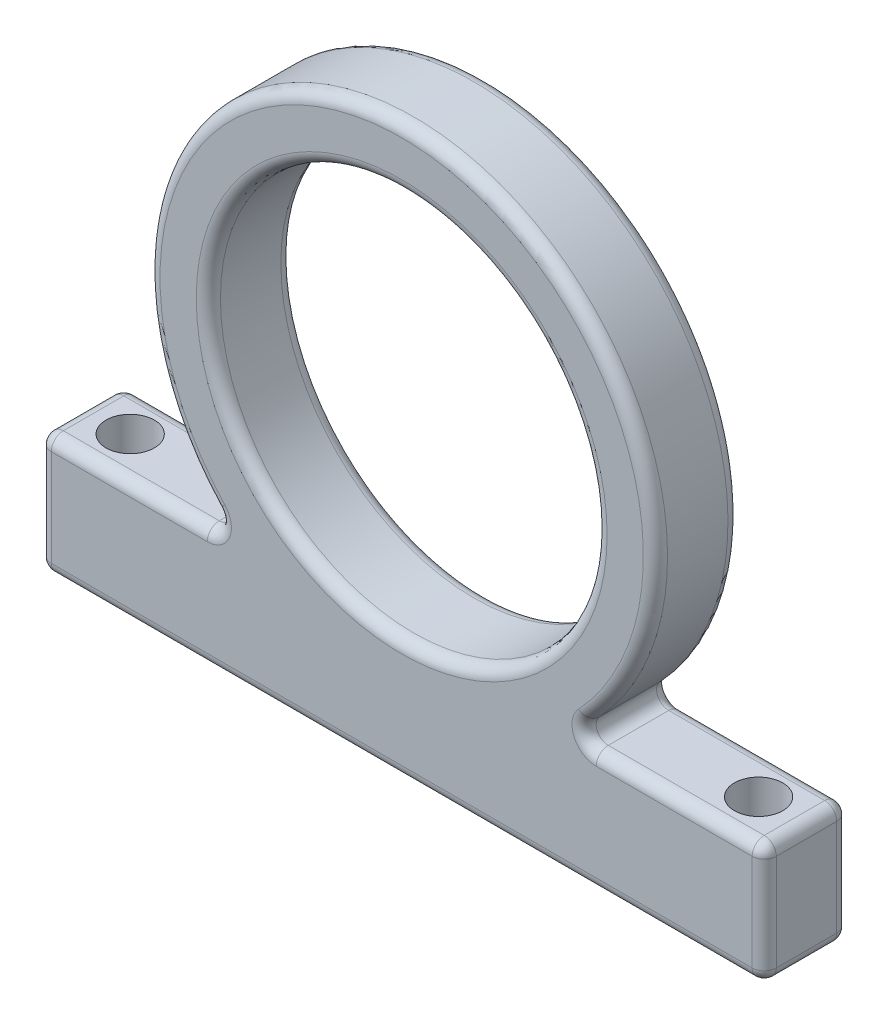
ISO-10303-21;
HEADER;
FILE_DESCRIPTION(('STEP AP214'),'2;1');
FILE_NAME('part.step','',(''),(''),'','','');
FILE_SCHEMA(('AUTOMOTIVE_DESIGN { 1 0 10303 214 1 1 1 1 }'));
ENDSEC;
DATA;
#1=APPLICATION_CONTEXT('core data for automotive mechanical design processes');
#2=APPLICATION_PROTOCOL_DEFINITION('international standard','automotive_design',2000,#1);
#3=PRODUCT_CONTEXT('',#1,'mechanical');
#4=PRODUCT('Part','Part','',(#3));
#5=PRODUCT_RELATED_PRODUCT_CATEGORY('part','',(#4));
#6=PRODUCT_DEFINITION_FORMATION('','',#4);
#7=PRODUCT_DEFINITION_CONTEXT('part definition',#1,'design');
#8=PRODUCT_DEFINITION('design','',#6,#7);
#9=PRODUCT_DEFINITION_SHAPE('','',#8);
#10=(LENGTH_UNIT() NAMED_UNIT(*) SI_UNIT(.MILLI.,.METRE.));
#11=(NAMED_UNIT(*) PLANE_ANGLE_UNIT() SI_UNIT($,.RADIAN.));
#12=(NAMED_UNIT(*) SI_UNIT($,.STERADIAN.) SOLID_ANGLE_UNIT());
#13=UNCERTAINTY_MEASURE_WITH_UNIT(LENGTH_MEASURE(1.E-05),#10,'distance_accuracy_value','');
#14=(GEOMETRIC_REPRESENTATION_CONTEXT(3) GLOBAL_UNCERTAINTY_ASSIGNED_CONTEXT((#13)) GLOBAL_UNIT_ASSIGNED_CONTEXT((#10,
#11,#12)) REPRESENTATION_CONTEXT('',''));
#15=CARTESIAN_POINT('',(0.,0.,0.));
#16=DIRECTION('',(0.,0.,1.));
#17=DIRECTION('',(1.,0.,0.));
#18=AXIS2_PLACEMENT_3D('',#15,#16,#17);
#19=CARTESIAN_POINT('',(0.,0.,7.));
#20=DIRECTION('',(0.,0.,-1.));
#21=DIRECTION('',(-1.,0.,0.));
#22=AXIS2_PLACEMENT_3D('',#19,#20,#21);
#23=PLANE('',#22);
#24=CARTESIAN_POINT('',(0.,0.,7.));
#25=DIRECTION('',(0.,0.,-1.));
#26=DIRECTION('',(-1.,0.,0.));
#27=AXIS2_PLACEMENT_3D('',#24,#25,#26);
#28=CIRCLE('',#27,17.);
#29=CARTESIAN_POINT('',(-17.,0.,7.));
#30=VERTEX_POINT('',#29);
#31=EDGE_CURVE('E193',#30,#30,#28,.T.);
#32=ORIENTED_EDGE('',*,*,#31,.T.);
#33=EDGE_LOOP('',(#32));
#34=FACE_BOUND('',#33,.T.);
#35=DIRECTION('',(-1.,0.,0.));
#36=VECTOR('',#35,1.);
#37=CARTESIAN_POINT('',(0.,-17.,7.));
#38=LINE('',#37,#36);
#39=CARTESIAN_POINT('',(-16.0934769394311,-17.,7.));
#40=VERTEX_POINT('',#39);
#41=CARTESIAN_POINT('',(-29.,-17.,7.));
#42=VERTEX_POINT('',#41);
#43=EDGE_CURVE('E349',#40,#42,#38,.T.);
#44=ORIENTED_EDGE('',*,*,#43,.T.);
#45=DIRECTION('',(0.,-1.,0.));
#46=VECTOR('',#45,1.);
#47=CARTESIAN_POINT('',(-29.,0.,7.));
#48=LINE('',#47,#46);
#49=CARTESIAN_POINT('',(-29.,-25.,7.));
#50=VERTEX_POINT('',#49);
#51=EDGE_CURVE('E268',#42,#50,#48,.T.);
#52=ORIENTED_EDGE('',*,*,#51,.T.);
#53=DIRECTION('',(1.,0.,0.));
#54=VECTOR('',#53,1.);
#55=CARTESIAN_POINT('',(0.,-25.,7.));
#56=LINE('',#55,#54);
#57=CARTESIAN_POINT('',(29.,-25.,7.));
#58=VERTEX_POINT('',#57);
#59=EDGE_CURVE('E266',#50,#58,#56,.T.);
#60=ORIENTED_EDGE('',*,*,#59,.T.);
#61=DIRECTION('',(0.,1.,0.));
#62=VECTOR('',#61,1.);
#63=CARTESIAN_POINT('',(29.,0.,7.));
#64=LINE('',#63,#62);
#65=CARTESIAN_POINT('',(29.,-17.,7.));
#66=VERTEX_POINT('',#65);
#67=EDGE_CURVE('E264',#58,#66,#64,.T.);
#68=ORIENTED_EDGE('',*,*,#67,.T.);
#69=DIRECTION('',(-1.,0.,0.));
#70=VECTOR('',#69,1.);
#71=CARTESIAN_POINT('',(0.,-17.,7.));
#72=LINE('',#71,#70);
#73=CARTESIAN_POINT('',(16.0934769394311,-17.,7.));
#74=VERTEX_POINT('',#73);
#75=EDGE_CURVE('E176',#66,#74,#72,.T.);
#76=ORIENTED_EDGE('',*,*,#75,.T.);
#77=CARTESIAN_POINT('',(16.0934769394311,-15.,7.));
#78=DIRECTION('',(0.,0.,-1.));
#79=DIRECTION('',(-1.,0.,0.));
#80=AXIS2_PLACEMENT_3D('',#77,#78,#79);
#81=CIRCLE('',#80,2.);
#82=CARTESIAN_POINT('',(14.630433581301,-13.6363636363636,7.));
#83=VERTEX_POINT('',#82);
#84=EDGE_CURVE('E170',#74,#83,#81,.T.);
#85=ORIENTED_EDGE('',*,*,#84,.T.);
#86=CARTESIAN_POINT('',(0.,0.,7.));
#87=DIRECTION('',(0.,0.,-1.));
#88=DIRECTION('',(-1.,0.,0.));
#89=AXIS2_PLACEMENT_3D('',#86,#87,#88);
#90=CIRCLE('',#89,20.);
#91=CARTESIAN_POINT('',(-14.630433581301,-13.6363636363636,7.));
#92=VERTEX_POINT('',#91);
#93=EDGE_CURVE('E173',#83,#92,#90,.F.);
#94=ORIENTED_EDGE('',*,*,#93,.T.);
#95=CARTESIAN_POINT('',(-16.0934769394311,-15.,7.));
#96=DIRECTION('',(0.,0.,-1.));
#97=DIRECTION('',(-1.,0.,0.));
#98=AXIS2_PLACEMENT_3D('',#95,#96,#97);
#99=CIRCLE('',#98,2.);
#100=EDGE_CURVE('E391',#92,#40,#99,.T.);
#101=ORIENTED_EDGE('',*,*,#100,.T.);
#102=EDGE_LOOP('',(#44,#52,#60,#68,#76,#85,#94,#101));
#103=FACE_BOUND('',#102,.T.);
#104=ADVANCED_FACE('F35',(#34,#103),#23,.F.);
#105=CARTESIAN_POINT('',(0.,0.,0.));
#106=DIRECTION('',(0.,0.,-1.));
#107=DIRECTION('',(-1.,0.,0.));
#108=AXIS2_PLACEMENT_3D('',#105,#106,#107);
#109=PLANE('',#108);
#110=CARTESIAN_POINT('',(0.,0.,0.));
#111=DIRECTION('',(0.,0.,-1.));
#112=DIRECTION('',(-1.,0.,0.));
#113=AXIS2_PLACEMENT_3D('',#110,#111,#112);
#114=CIRCLE('',#113,17.);
#115=CARTESIAN_POINT('',(-17.,0.,0.));
#116=VERTEX_POINT('',#115);
#117=EDGE_CURVE('E366',#116,#116,#114,.F.);
#118=ORIENTED_EDGE('',*,*,#117,.T.);
#119=EDGE_LOOP('',(#118));
#120=FACE_BOUND('',#119,.T.);
#121=DIRECTION('',(1.,0.,0.));
#122=VECTOR('',#121,1.);
#123=CARTESIAN_POINT('',(-30.,-25.,0.));
#124=LINE('',#123,#122);
#125=CARTESIAN_POINT('',(29.,-25.,0.));
#126=VERTEX_POINT('',#125);
#127=CARTESIAN_POINT('',(-29.,-25.,0.));
#128=VERTEX_POINT('',#127);
#129=EDGE_CURVE('E258',#126,#128,#124,.F.);
#130=ORIENTED_EDGE('',*,*,#129,.T.);
#131=DIRECTION('',(0.,-1.,0.));
#132=VECTOR('',#131,1.);
#133=CARTESIAN_POINT('',(-29.,-17.,0.));
#134=LINE('',#133,#132);
#135=CARTESIAN_POINT('',(-29.,-17.,0.));
#136=VERTEX_POINT('',#135);
#137=EDGE_CURVE('E262',#128,#136,#134,.F.);
#138=ORIENTED_EDGE('',*,*,#137,.T.);
#139=DIRECTION('',(-1.,0.,0.));
#140=VECTOR('',#139,1.);
#141=CARTESIAN_POINT('',(-13.6014705087354,-17.,0.));
#142=LINE('',#141,#140);
#143=CARTESIAN_POINT('',(-16.0934769394311,-17.,0.));
#144=VERTEX_POINT('',#143);
#145=EDGE_CURVE('E371',#136,#144,#142,.F.);
#146=ORIENTED_EDGE('',*,*,#145,.T.);
#147=CARTESIAN_POINT('',(-16.0934769394311,-15.,0.));
#148=DIRECTION('',(0.,0.,-1.));
#149=DIRECTION('',(-1.,0.,0.));
#150=AXIS2_PLACEMENT_3D('',#147,#148,#149);
#151=CIRCLE('',#150,2.);
#152=CARTESIAN_POINT('',(-14.630433581301,-13.6363636363636,0.));
#153=VERTEX_POINT('',#152);
#154=EDGE_CURVE('E181',#144,#153,#151,.F.);
#155=ORIENTED_EDGE('',*,*,#154,.T.);
#156=CARTESIAN_POINT('',(0.,0.,0.));
#157=DIRECTION('',(0.,0.,-1.));
#158=DIRECTION('',(-1.,0.,0.));
#159=AXIS2_PLACEMENT_3D('',#156,#157,#158);
#160=CIRCLE('',#159,20.);
#161=CARTESIAN_POINT('',(14.630433581301,-13.6363636363636,0.));
#162=VERTEX_POINT('',#161);
#163=EDGE_CURVE('E369',#153,#162,#160,.T.);
#164=ORIENTED_EDGE('',*,*,#163,.T.);
#165=CARTESIAN_POINT('',(16.0934769394311,-15.,0.));
#166=DIRECTION('',(0.,0.,-1.));
#167=DIRECTION('',(-1.,0.,0.));
#168=AXIS2_PLACEMENT_3D('',#165,#166,#167);
#169=CIRCLE('',#168,2.);
#170=CARTESIAN_POINT('',(16.0934769394311,-17.,0.));
#171=VERTEX_POINT('',#170);
#172=EDGE_CURVE('E232',#162,#171,#169,.F.);
#173=ORIENTED_EDGE('',*,*,#172,.T.);
#174=DIRECTION('',(-1.,0.,0.));
#175=VECTOR('',#174,1.);
#176=CARTESIAN_POINT('',(30.,-17.,0.));
#177=LINE('',#176,#175);
#178=CARTESIAN_POINT('',(29.,-17.,0.));
#179=VERTEX_POINT('',#178);
#180=EDGE_CURVE('E373',#171,#179,#177,.F.);
#181=ORIENTED_EDGE('',*,*,#180,.T.);
#182=DIRECTION('',(0.,1.,0.));
#183=VECTOR('',#182,1.);
#184=CARTESIAN_POINT('',(29.,-26.,0.));
#185=LINE('',#184,#183);
#186=EDGE_CURVE('E260',#179,#126,#185,.F.);
#187=ORIENTED_EDGE('',*,*,#186,.T.);
#188=EDGE_LOOP('',(#130,#138,#146,#155,#164,#173,#181,#187));
#189=FACE_BOUND('',#188,.T.);
#190=ADVANCED_FACE('F418',(#120,#189),#109,.T.);
#191=CARTESIAN_POINT('',(13.6014705087354,-16.,7.));
#192=DIRECTION('',(0.,-1.,0.));
#193=DIRECTION('',(0.,0.,-1.));
#194=AXIS2_PLACEMENT_3D('',#191,#192,#193);
#195=PLANE('',#194);
#196=CARTESIAN_POINT('',(26.,-16.,3.46767137957346));
#197=DIRECTION('',(0.,1.,0.));
#198=DIRECTION('',(0.,0.,1.));
#199=AXIS2_PLACEMENT_3D('',#196,#197,#198);
#200=CIRCLE('',#199,2.);
#201=CARTESIAN_POINT('',(26.,-16.,5.46767137957346));
#202=VERTEX_POINT('',#201);
#203=EDGE_CURVE('E340',#202,#202,#200,.T.);
#204=ORIENTED_EDGE('',*,*,#203,.F.);
#205=EDGE_LOOP('',(#204));
#206=FACE_BOUND('',#205,.T.);
#207=DIRECTION('',(-1.,0.,0.));
#208=VECTOR('',#207,1.);
#209=CARTESIAN_POINT('',(13.6014705087354,-16.,6.));
#210=LINE('',#209,#208);
#211=CARTESIAN_POINT('',(16.0934769394311,-16.,6.));
#212=VERTEX_POINT('',#211);
#213=CARTESIAN_POINT('',(29.,-16.,6.));
#214=VERTEX_POINT('',#213);
#215=EDGE_CURVE('E356',#212,#214,#210,.F.);
#216=ORIENTED_EDGE('',*,*,#215,.T.);
#217=DIRECTION('',(0.,0.,-1.));
#218=VECTOR('',#217,1.);
#219=CARTESIAN_POINT('',(29.,-16.,7.));
#220=LINE('',#219,#218);
#221=CARTESIAN_POINT('',(29.,-16.,1.));
#222=VERTEX_POINT('',#221);
#223=EDGE_CURVE('E270',#214,#222,#220,.T.);
#224=ORIENTED_EDGE('',*,*,#223,.T.);
#225=DIRECTION('',(-1.,0.,0.));
#226=VECTOR('',#225,1.);
#227=CARTESIAN_POINT('',(13.6014705087355,-16.,1.));
#228=LINE('',#227,#226);
#229=CARTESIAN_POINT('',(16.0934769394311,-16.,1.));
#230=VERTEX_POINT('',#229);
#231=EDGE_CURVE('E354',#222,#230,#228,.T.);
#232=ORIENTED_EDGE('',*,*,#231,.T.);
#233=DIRECTION('',(0.,0.,1.));
#234=VECTOR('',#233,1.);
#235=CARTESIAN_POINT('',(16.0934769394311,-16.,7.));
#236=LINE('',#235,#234);
#237=EDGE_CURVE('E352',#230,#212,#236,.T.);
#238=ORIENTED_EDGE('',*,*,#237,.T.);
#239=EDGE_LOOP('',(#216,#224,#232,#238));
#240=FACE_BOUND('',#239,.T.);
#241=ADVANCED_FACE('F399',(#206,#240),#195,.F.);
#242=CARTESIAN_POINT('',(0.,0.,7.));
#243=DIRECTION('',(0.,0.,-1.));
#244=DIRECTION('',(-1.,0.,0.));
#245=AXIS2_PLACEMENT_3D('',#242,#243,#244);
#246=CYLINDRICAL_SURFACE('',#245,21.);
#247=CARTESIAN_POINT('',(0.,0.,6.));
#248=DIRECTION('',(0.,0.,-1.));
#249=DIRECTION('',(-1.,0.,0.));
#250=AXIS2_PLACEMENT_3D('',#247,#248,#249);
#251=CIRCLE('',#250,21.);
#252=CARTESIAN_POINT('',(-15.361955260366,-14.3181818181818,6.));
#253=VERTEX_POINT('',#252);
#254=CARTESIAN_POINT('',(15.361955260366,-14.3181818181818,6.));
#255=VERTEX_POINT('',#254);
#256=EDGE_CURVE('E386',#253,#255,#251,.T.);
#257=ORIENTED_EDGE('',*,*,#256,.T.);
#258=DIRECTION('',(0.,0.,-1.));
#259=VECTOR('',#258,1.);
#260=CARTESIAN_POINT('',(15.361955260366,-14.3181818181818,7.));
#261=LINE('',#260,#259);
#262=CARTESIAN_POINT('',(15.361955260366,-14.3181818181818,1.));
#263=VERTEX_POINT('',#262);
#264=EDGE_CURVE('E182',#255,#263,#261,.T.);
#265=ORIENTED_EDGE('',*,*,#264,.T.);
#266=CARTESIAN_POINT('',(0.,0.,1.));
#267=DIRECTION('',(0.,0.,-1.));
#268=DIRECTION('',(-1.,0.,0.));
#269=AXIS2_PLACEMENT_3D('',#266,#267,#268);
#270=CIRCLE('',#269,21.);
#271=CARTESIAN_POINT('',(-15.361955260366,-14.3181818181818,1.));
#272=VERTEX_POINT('',#271);
#273=EDGE_CURVE('E384',#263,#272,#270,.F.);
#274=ORIENTED_EDGE('',*,*,#273,.T.);
#275=DIRECTION('',(0.,0.,-1.));
#276=VECTOR('',#275,1.);
#277=CARTESIAN_POINT('',(-15.361955260366,-14.3181818181818,7.));
#278=LINE('',#277,#276);
#279=EDGE_CURVE('E382',#272,#253,#278,.F.);
#280=ORIENTED_EDGE('',*,*,#279,.T.);
#281=EDGE_LOOP('',(#257,#265,#274,#280));
#282=FACE_BOUND('',#281,.T.);
#283=ADVANCED_FACE('F430',(#282),#246,.T.);
#284=CARTESIAN_POINT('',(-13.6014705087354,-16.,7.));
#285=DIRECTION('',(0.,-1.,0.));
#286=DIRECTION('',(1.,0.,0.));
#287=AXIS2_PLACEMENT_3D('',#284,#285,#286);
#288=PLANE('',#287);
#289=CARTESIAN_POINT('',(-26.,-16.,3.46767137957346));
#290=DIRECTION('',(0.,1.,0.));
#291=DIRECTION('',(0.,0.,1.));
#292=AXIS2_PLACEMENT_3D('',#289,#290,#291);
#293=CIRCLE('',#292,2.);
#294=CARTESIAN_POINT('',(-26.,-16.,5.46767137957346));
#295=VERTEX_POINT('',#294);
#296=EDGE_CURVE('E335',#295,#295,#293,.T.);
#297=ORIENTED_EDGE('',*,*,#296,.F.);
#298=EDGE_LOOP('',(#297));
#299=FACE_BOUND('',#298,.T.);
#300=DIRECTION('',(-1.,0.,0.));
#301=VECTOR('',#300,1.);
#302=CARTESIAN_POINT('',(-30.,-16.,1.));
#303=LINE('',#302,#301);
#304=CARTESIAN_POINT('',(-16.0934769394311,-16.,1.));
#305=VERTEX_POINT('',#304);
#306=CARTESIAN_POINT('',(-29.,-16.,1.));
#307=VERTEX_POINT('',#306);
#308=EDGE_CURVE('E361',#305,#307,#303,.T.);
#309=ORIENTED_EDGE('',*,*,#308,.T.);
#310=DIRECTION('',(0.,0.,-1.));
#311=VECTOR('',#310,1.);
#312=CARTESIAN_POINT('',(-29.,-16.,7.));
#313=LINE('',#312,#311);
#314=CARTESIAN_POINT('',(-29.,-16.,6.));
#315=VERTEX_POINT('',#314);
#316=EDGE_CURVE('E256',#307,#315,#313,.F.);
#317=ORIENTED_EDGE('',*,*,#316,.T.);
#318=DIRECTION('',(-1.,0.,0.));
#319=VECTOR('',#318,1.);
#320=CARTESIAN_POINT('',(-13.6014705087354,-16.,6.));
#321=LINE('',#320,#319);
#322=CARTESIAN_POINT('',(-16.0934769394311,-16.,6.));
#323=VERTEX_POINT('',#322);
#324=EDGE_CURVE('E364',#315,#323,#321,.F.);
#325=ORIENTED_EDGE('',*,*,#324,.T.);
#326=DIRECTION('',(0.,0.,1.));
#327=VECTOR('',#326,1.);
#328=CARTESIAN_POINT('',(-16.0934769394311,-16.,0.));
#329=LINE('',#328,#327);
#330=EDGE_CURVE('E359',#323,#305,#329,.F.);
#331=ORIENTED_EDGE('',*,*,#330,.T.);
#332=EDGE_LOOP('',(#309,#317,#325,#331));
#333=FACE_BOUND('',#332,.T.);
#334=ADVANCED_FACE('F532',(#299,#333),#288,.F.);
#335=CARTESIAN_POINT('',(-30.,-26.,7.));
#336=DIRECTION('',(1.,0.,0.));
#337=DIRECTION('',(0.,1.,0.));
#338=AXIS2_PLACEMENT_3D('',#335,#336,#337);
#339=PLANE('',#338);
#340=DIRECTION('',(0.,0.,-1.));
#341=VECTOR('',#340,1.);
#342=CARTESIAN_POINT('',(-30.,-17.,7.));
#343=LINE('',#342,#341);
#344=CARTESIAN_POINT('',(-30.,-17.,6.));
#345=VERTEX_POINT('',#344);
#346=CARTESIAN_POINT('',(-30.,-17.,1.));
#347=VERTEX_POINT('',#346);
#348=EDGE_CURVE('E249',#345,#347,#343,.T.);
#349=ORIENTED_EDGE('',*,*,#348,.T.);
#350=DIRECTION('',(0.,-1.,0.));
#351=VECTOR('',#350,1.);
#352=CARTESIAN_POINT('',(-30.,-26.,1.));
#353=LINE('',#352,#351);
#354=CARTESIAN_POINT('',(-30.,-25.,1.));
#355=VERTEX_POINT('',#354);
#356=EDGE_CURVE('E254',#347,#355,#353,.T.);
#357=ORIENTED_EDGE('',*,*,#356,.T.);
#358=DIRECTION('',(0.,0.,-1.));
#359=VECTOR('',#358,1.);
#360=CARTESIAN_POINT('',(-30.,-25.,7.));
#361=LINE('',#360,#359);
#362=CARTESIAN_POINT('',(-30.,-25.,6.));
#363=VERTEX_POINT('',#362);
#364=EDGE_CURVE('E251',#355,#363,#361,.F.);
#365=ORIENTED_EDGE('',*,*,#364,.T.);
#366=DIRECTION('',(0.,-1.,0.));
#367=VECTOR('',#366,1.);
#368=CARTESIAN_POINT('',(-30.,-26.,6.));
#369=LINE('',#368,#367);
#370=EDGE_CURVE('E247',#363,#345,#369,.F.);
#371=ORIENTED_EDGE('',*,*,#370,.T.);
#372=EDGE_LOOP('',(#349,#357,#365,#371));
#373=FACE_BOUND('',#372,.T.);
#374=ADVANCED_FACE('F456',(#373),#339,.F.);
#375=CARTESIAN_POINT('',(30.,-26.,7.));
#376=DIRECTION('',(0.,1.,0.));
#377=DIRECTION('',(-1.,0.,0.));
#378=AXIS2_PLACEMENT_3D('',#375,#376,#377);
#379=PLANE('',#378);
#380=CARTESIAN_POINT('',(-26.,-26.,3.46767137957346));
#381=DIRECTION('',(0.,1.,0.));
#382=DIRECTION('',(-1.,0.,0.));
#383=AXIS2_PLACEMENT_3D('',#380,#381,#382);
#384=CIRCLE('',#383,2.);
#385=CARTESIAN_POINT('',(-28.,-26.,3.46767137957346));
#386=VERTEX_POINT('',#385);
#387=EDGE_CURVE('E39',#386,#386,#384,.T.);
#388=ORIENTED_EDGE('',*,*,#387,.T.);
#389=EDGE_LOOP('',(#388));
#390=FACE_BOUND('',#389,.T.);
#391=CARTESIAN_POINT('',(26.,-26.,3.46767137957346));
#392=DIRECTION('',(0.,1.,0.));
#393=DIRECTION('',(-1.,0.,0.));
#394=AXIS2_PLACEMENT_3D('',#391,#392,#393);
#395=CIRCLE('',#394,2.);
#396=CARTESIAN_POINT('',(24.,-26.,3.46767137957346));
#397=VERTEX_POINT('',#396);
#398=EDGE_CURVE('E333',#397,#397,#395,.T.);
#399=ORIENTED_EDGE('',*,*,#398,.T.);
#400=EDGE_LOOP('',(#399));
#401=FACE_BOUND('',#400,.T.);
#402=DIRECTION('',(0.,0.,-1.));
#403=VECTOR('',#402,1.);
#404=CARTESIAN_POINT('',(-29.,-26.,7.));
#405=LINE('',#404,#403);
#406=CARTESIAN_POINT('',(-29.,-26.,6.));
#407=VERTEX_POINT('',#406);
#408=CARTESIAN_POINT('',(-29.,-26.,1.));
#409=VERTEX_POINT('',#408);
#410=EDGE_CURVE('E242',#407,#409,#405,.T.);
#411=ORIENTED_EDGE('',*,*,#410,.T.);
#412=DIRECTION('',(1.,0.,0.));
#413=VECTOR('',#412,1.);
#414=CARTESIAN_POINT('',(30.,-26.,1.));
#415=LINE('',#414,#413);
#416=CARTESIAN_POINT('',(29.,-26.,1.));
#417=VERTEX_POINT('',#416);
#418=EDGE_CURVE('E245',#409,#417,#415,.T.);
#419=ORIENTED_EDGE('',*,*,#418,.T.);
#420=DIRECTION('',(0.,0.,-1.));
#421=VECTOR('',#420,1.);
#422=CARTESIAN_POINT('',(29.,-26.,7.));
#423=LINE('',#422,#421);
#424=CARTESIAN_POINT('',(29.,-26.,6.));
#425=VERTEX_POINT('',#424);
#426=EDGE_CURVE('E240',#417,#425,#423,.F.);
#427=ORIENTED_EDGE('',*,*,#426,.T.);
#428=DIRECTION('',(1.,0.,0.));
#429=VECTOR('',#428,1.);
#430=CARTESIAN_POINT('',(30.,-26.,6.));
#431=LINE('',#430,#429);
#432=EDGE_CURVE('E238',#425,#407,#431,.F.);
#433=ORIENTED_EDGE('',*,*,#432,.T.);
#434=EDGE_LOOP('',(#411,#419,#427,#433));
#435=FACE_BOUND('',#434,.T.);
#436=ADVANCED_FACE('F477',(#390,#401,#435),#379,.F.);
#437=CARTESIAN_POINT('',(30.,-16.,7.));
#438=DIRECTION('',(-1.,0.,0.));
#439=DIRECTION('',(0.,-1.,0.));
#440=AXIS2_PLACEMENT_3D('',#437,#438,#439);
#441=PLANE('',#440);
#442=DIRECTION('',(0.,1.,0.));
#443=VECTOR('',#442,1.);
#444=CARTESIAN_POINT('',(30.,-17.,1.));
#445=LINE('',#444,#443);
#446=CARTESIAN_POINT('',(30.,-25.,1.));
#447=VERTEX_POINT('',#446);
#448=CARTESIAN_POINT('',(30.,-17.,1.));
#449=VERTEX_POINT('',#448);
#450=EDGE_CURVE('E44',#447,#449,#445,.T.);
#451=ORIENTED_EDGE('',*,*,#450,.T.);
#452=DIRECTION('',(0.,0.,-1.));
#453=VECTOR('',#452,1.);
#454=CARTESIAN_POINT('',(30.,-17.,7.));
#455=LINE('',#454,#453);
#456=CARTESIAN_POINT('',(30.,-17.,6.));
#457=VERTEX_POINT('',#456);
#458=EDGE_CURVE('E11',#449,#457,#455,.F.);
#459=ORIENTED_EDGE('',*,*,#458,.T.);
#460=DIRECTION('',(0.,1.,0.));
#461=VECTOR('',#460,1.);
#462=CARTESIAN_POINT('',(30.,-16.,6.));
#463=LINE('',#462,#461);
#464=CARTESIAN_POINT('',(30.,-25.,6.));
#465=VERTEX_POINT('',#464);
#466=EDGE_CURVE('E272',#457,#465,#463,.F.);
#467=ORIENTED_EDGE('',*,*,#466,.T.);
#468=DIRECTION('',(0.,0.,-1.));
#469=VECTOR('',#468,1.);
#470=CARTESIAN_POINT('',(30.,-25.,7.));
#471=LINE('',#470,#469);
#472=EDGE_CURVE('E55',#465,#447,#471,.T.);
#473=ORIENTED_EDGE('',*,*,#472,.T.);
#474=EDGE_LOOP('',(#451,#459,#467,#473));
#475=FACE_BOUND('',#474,.T.);
#476=ADVANCED_FACE('F524',(#475),#441,.F.);
#477=CARTESIAN_POINT('',(0.,0.,7.));
#478=DIRECTION('',(0.,0.,-1.));
#479=DIRECTION('',(-1.,0.,0.));
#480=AXIS2_PLACEMENT_3D('',#477,#478,#479);
#481=CYLINDRICAL_SURFACE('',#480,16.);
#482=CARTESIAN_POINT('',(0.,0.,6.));
#483=DIRECTION('',(0.,0.,-1.));
#484=DIRECTION('',(-1.,0.,0.));
#485=AXIS2_PLACEMENT_3D('',#482,#483,#484);
#486=CIRCLE('',#485,16.);
#487=CARTESIAN_POINT('',(-16.,0.,6.));
#488=VERTEX_POINT('',#487);
#489=EDGE_CURVE('E379',#488,#488,#486,.F.);
#490=ORIENTED_EDGE('',*,*,#489,.T.);
#491=EDGE_LOOP('',(#490));
#492=FACE_BOUND('',#491,.T.);
#493=CARTESIAN_POINT('',(0.,0.,1.));
#494=DIRECTION('',(0.,0.,-1.));
#495=DIRECTION('',(-1.,0.,0.));
#496=AXIS2_PLACEMENT_3D('',#493,#494,#495);
#497=CIRCLE('',#496,16.);
#498=CARTESIAN_POINT('',(-16.,0.,1.));
#499=VERTEX_POINT('',#498);
#500=EDGE_CURVE('E376',#499,#499,#497,.T.);
#501=ORIENTED_EDGE('',*,*,#500,.T.);
#502=EDGE_LOOP('',(#501));
#503=FACE_BOUND('',#502,.T.);
#504=ADVANCED_FACE('F521',(#492,#503),#481,.F.);
#505=CARTESIAN_POINT('',(-13.6014705087354,-17.,1.));
#506=DIRECTION('',(1.,0.,0.));
#507=DIRECTION('',(0.,1.,0.));
#508=AXIS2_PLACEMENT_3D('',#505,#506,#507);
#509=CYLINDRICAL_SURFACE('',#508,1.);
#510=ORIENTED_EDGE('',*,*,#145,.F.);
#511=CARTESIAN_POINT('',(-29.,-17.,1.));
#512=DIRECTION('',(1.,0.,0.));
#513=DIRECTION('',(0.,1.,0.));
#514=AXIS2_PLACEMENT_3D('',#511,#512,#513);
#515=CIRCLE('',#514,1.);
#516=EDGE_CURVE('E228',#136,#307,#515,.T.);
#517=ORIENTED_EDGE('',*,*,#516,.T.);
#518=ORIENTED_EDGE('',*,*,#308,.F.);
#519=CARTESIAN_POINT('',(-16.0934769394311,-17.,1.));
#520=DIRECTION('',(1.,0.,0.));
#521=DIRECTION('',(0.,0.,-1.));
#522=AXIS2_PLACEMENT_3D('',#519,#520,#521);
#523=CIRCLE('',#522,1.);
#524=EDGE_CURVE('E194',#144,#305,#523,.T.);
#525=ORIENTED_EDGE('',*,*,#524,.F.);
#526=EDGE_LOOP('',(#510,#517,#518,#525));
#527=FACE_BOUND('',#526,.T.);
#528=ADVANCED_FACE('F567',(#527),#509,.T.);
#529=CARTESIAN_POINT('',(-16.0934769394311,-15.,1.));
#530=DIRECTION('',(0.,0.,-1.));
#531=DIRECTION('',(-1.,0.,0.));
#532=AXIS2_PLACEMENT_3D('',#529,#530,#531);
#533=TOROIDAL_SURFACE('',#532,2.,1.);
#534=ORIENTED_EDGE('',*,*,#154,.F.);
#535=ORIENTED_EDGE('',*,*,#524,.T.);
#536=CARTESIAN_POINT('',(-16.0934769394311,-15.,1.));
#537=DIRECTION('',(0.,0.,-1.));
#538=DIRECTION('',(-1.,0.,0.));
#539=AXIS2_PLACEMENT_3D('',#536,#537,#538);
#540=CIRCLE('',#539,1.);
#541=EDGE_CURVE('E223',#272,#305,#540,.T.);
#542=ORIENTED_EDGE('',*,*,#541,.F.);
#543=CARTESIAN_POINT('',(-14.630433581301,-13.6363636363636,1.));
#544=DIRECTION('',(0.681818181818182,-0.731521679065049,0.));
#545=DIRECTION('',(0.731521679065049,0.681818181818182,0.));
#546=AXIS2_PLACEMENT_3D('',#543,#544,#545);
#547=CIRCLE('',#546,1.);
#548=EDGE_CURVE('E220',#153,#272,#547,.F.);
#549=ORIENTED_EDGE('',*,*,#548,.F.);
#550=EDGE_LOOP('',(#534,#535,#542,#549));
#551=FACE_BOUND('',#550,.T.);
#552=ADVANCED_FACE('F564',(#551),#533,.T.);
#553=CARTESIAN_POINT('',(0.,-17.,6.));
#554=DIRECTION('',(-1.,0.,0.));
#555=DIRECTION('',(0.,-1.,0.));
#556=AXIS2_PLACEMENT_3D('',#553,#554,#555);
#557=CYLINDRICAL_SURFACE('',#556,1.);
#558=ORIENTED_EDGE('',*,*,#324,.F.);
#559=CARTESIAN_POINT('',(-29.,-17.,6.));
#560=DIRECTION('',(-1.,0.,0.));
#561=DIRECTION('',(0.,-1.,0.));
#562=AXIS2_PLACEMENT_3D('',#559,#560,#561);
#563=CIRCLE('',#562,1.);
#564=EDGE_CURVE('E231',#315,#42,#563,.F.);
#565=ORIENTED_EDGE('',*,*,#564,.T.);
#566=ORIENTED_EDGE('',*,*,#43,.F.);
#567=CARTESIAN_POINT('',(-16.0934769394311,-17.,6.));
#568=DIRECTION('',(1.,0.,0.));
#569=DIRECTION('',(0.,0.,-1.));
#570=AXIS2_PLACEMENT_3D('',#567,#568,#569);
#571=CIRCLE('',#570,1.);
#572=EDGE_CURVE('E217',#323,#40,#571,.T.);
#573=ORIENTED_EDGE('',*,*,#572,.F.);
#574=EDGE_LOOP('',(#558,#565,#566,#573));
#575=FACE_BOUND('',#574,.T.);
#576=ADVANCED_FACE('F443',(#575),#557,.T.);
#577=CARTESIAN_POINT('',(-16.0934769394311,-15.,7.));
#578=DIRECTION('',(0.,0.,-1.));
#579=DIRECTION('',(-1.,0.,0.));
#580=AXIS2_PLACEMENT_3D('',#577,#578,#579);
#581=CYLINDRICAL_SURFACE('',#580,1.);
#582=ORIENTED_EDGE('',*,*,#541,.T.);
#583=ORIENTED_EDGE('',*,*,#330,.F.);
#584=CARTESIAN_POINT('',(-16.0934769394311,-15.,6.));
#585=DIRECTION('',(0.,0.,-1.));
#586=DIRECTION('',(-1.,0.,0.));
#587=AXIS2_PLACEMENT_3D('',#584,#585,#586);
#588=CIRCLE('',#587,1.);
#589=EDGE_CURVE('E214',#253,#323,#588,.T.);
#590=ORIENTED_EDGE('',*,*,#589,.F.);
#591=ORIENTED_EDGE('',*,*,#279,.F.);
#592=EDGE_LOOP('',(#582,#583,#590,#591));
#593=FACE_BOUND('',#592,.T.);
#594=ADVANCED_FACE('F435',(#593),#581,.F.);
#595=CARTESIAN_POINT('',(0.,0.,1.));
#596=DIRECTION('',(0.,0.,-1.));
#597=DIRECTION('',(-1.,0.,0.));
#598=AXIS2_PLACEMENT_3D('',#595,#596,#597);
#599=TOROIDAL_SURFACE('',#598,20.,1.);
#600=ORIENTED_EDGE('',*,*,#548,.T.);
#601=ORIENTED_EDGE('',*,*,#273,.F.);
#602=CARTESIAN_POINT('',(14.630433581301,-13.6363636363636,1.));
#603=DIRECTION('',(-0.681818181818181,-0.73152167906505,0.));
#604=DIRECTION('',(0.73152167906505,-0.681818181818181,0.));
#605=AXIS2_PLACEMENT_3D('',#602,#603,#604);
#606=CIRCLE('',#605,1.);
#607=EDGE_CURVE('E211',#162,#263,#606,.T.);
#608=ORIENTED_EDGE('',*,*,#607,.F.);
#609=ORIENTED_EDGE('',*,*,#163,.F.);
#610=EDGE_LOOP('',(#600,#601,#608,#609));
#611=FACE_BOUND('',#610,.T.);
#612=ADVANCED_FACE('F556',(#611),#599,.T.);
#613=CARTESIAN_POINT('',(13.6014705087354,-17.,1.));
#614=DIRECTION('',(1.,0.,0.));
#615=DIRECTION('',(0.,0.,-1.));
#616=AXIS2_PLACEMENT_3D('',#613,#614,#615);
#617=CYLINDRICAL_SURFACE('',#616,1.);
#618=ORIENTED_EDGE('',*,*,#231,.F.);
#619=CARTESIAN_POINT('',(29.,-17.,1.));
#620=DIRECTION('',(1.,0.,0.));
#621=DIRECTION('',(0.,0.,-1.));
#622=AXIS2_PLACEMENT_3D('',#619,#620,#621);
#623=CIRCLE('',#622,1.);
#624=EDGE_CURVE('E234',#222,#179,#623,.F.);
#625=ORIENTED_EDGE('',*,*,#624,.T.);
#626=ORIENTED_EDGE('',*,*,#180,.F.);
#627=CARTESIAN_POINT('',(16.0934769394311,-17.,1.));
#628=DIRECTION('',(-1.,0.,0.));
#629=DIRECTION('',(0.,0.,1.));
#630=AXIS2_PLACEMENT_3D('',#627,#628,#629);
#631=CIRCLE('',#630,1.);
#632=EDGE_CURVE('E208',#230,#171,#631,.T.);
#633=ORIENTED_EDGE('',*,*,#632,.F.);
#634=EDGE_LOOP('',(#618,#625,#626,#633));
#635=FACE_BOUND('',#634,.T.);
#636=ADVANCED_FACE('F415',(#635),#617,.T.);
#637=CARTESIAN_POINT('',(-16.0934769394311,-15.,6.));
#638=DIRECTION('',(0.,0.,-1.));
#639=DIRECTION('',(-1.,0.,0.));
#640=AXIS2_PLACEMENT_3D('',#637,#638,#639);
#641=TOROIDAL_SURFACE('',#640,2.,1.);
#642=ORIENTED_EDGE('',*,*,#572,.T.);
#643=ORIENTED_EDGE('',*,*,#100,.F.);
#644=CARTESIAN_POINT('',(-14.630433581301,-13.6363636363636,6.));
#645=DIRECTION('',(0.681818181818182,-0.731521679065049,0.));
#646=DIRECTION('',(0.731521679065049,0.681818181818182,0.));
#647=AXIS2_PLACEMENT_3D('',#644,#645,#646);
#648=CIRCLE('',#647,1.);
#649=EDGE_CURVE('E192',#253,#92,#648,.F.);
#650=ORIENTED_EDGE('',*,*,#649,.F.);
#651=ORIENTED_EDGE('',*,*,#589,.T.);
#652=EDGE_LOOP('',(#642,#643,#650,#651));
#653=FACE_BOUND('',#652,.T.);
#654=ADVANCED_FACE('F438',(#653),#641,.T.);
#655=CARTESIAN_POINT('',(16.0934769394311,-15.,1.));
#656=DIRECTION('',(0.,0.,-1.));
#657=DIRECTION('',(-1.,0.,0.));
#658=AXIS2_PLACEMENT_3D('',#655,#656,#657);
#659=TOROIDAL_SURFACE('',#658,2.,1.);
#660=ORIENTED_EDGE('',*,*,#172,.F.);
#661=ORIENTED_EDGE('',*,*,#607,.T.);
#662=CARTESIAN_POINT('',(16.0934769394311,-15.,1.));
#663=DIRECTION('',(0.,0.,-1.));
#664=DIRECTION('',(-1.,0.,0.));
#665=AXIS2_PLACEMENT_3D('',#662,#663,#664);
#666=CIRCLE('',#665,1.);
#667=EDGE_CURVE('E199',#230,#263,#666,.T.);
#668=ORIENTED_EDGE('',*,*,#667,.F.);
#669=ORIENTED_EDGE('',*,*,#632,.T.);
#670=EDGE_LOOP('',(#660,#661,#668,#669));
#671=FACE_BOUND('',#670,.T.);
#672=ADVANCED_FACE('F424',(#671),#659,.T.);
#673=CARTESIAN_POINT('',(0.,0.,6.));
#674=DIRECTION('',(0.,0.,-1.));
#675=DIRECTION('',(-1.,0.,0.));
#676=AXIS2_PLACEMENT_3D('',#673,#674,#675);
#677=TOROIDAL_SURFACE('',#676,20.,1.);
#678=ORIENTED_EDGE('',*,*,#649,.T.);
#679=ORIENTED_EDGE('',*,*,#93,.F.);
#680=CARTESIAN_POINT('',(14.630433581301,-13.6363636363636,6.));
#681=DIRECTION('',(-0.681818181818181,-0.73152167906505,0.));
#682=DIRECTION('',(0.73152167906505,-0.681818181818181,0.));
#683=AXIS2_PLACEMENT_3D('',#680,#681,#682);
#684=CIRCLE('',#683,1.);
#685=EDGE_CURVE('E189',#255,#83,#684,.T.);
#686=ORIENTED_EDGE('',*,*,#685,.F.);
#687=ORIENTED_EDGE('',*,*,#256,.F.);
#688=EDGE_LOOP('',(#678,#679,#686,#687));
#689=FACE_BOUND('',#688,.T.);
#690=ADVANCED_FACE('F187',(#689),#677,.T.);
#691=CARTESIAN_POINT('',(16.0934769394311,-15.,7.));
#692=DIRECTION('',(0.,0.,-1.));
#693=DIRECTION('',(-1.,0.,0.));
#694=AXIS2_PLACEMENT_3D('',#691,#692,#693);
#695=CYLINDRICAL_SURFACE('',#694,1.);
#696=ORIENTED_EDGE('',*,*,#667,.T.);
#697=ORIENTED_EDGE('',*,*,#264,.F.);
#698=CARTESIAN_POINT('',(16.0934769394311,-15.,6.));
#699=DIRECTION('',(0.,0.,-1.));
#700=DIRECTION('',(-1.,0.,0.));
#701=AXIS2_PLACEMENT_3D('',#698,#699,#700);
#702=CIRCLE('',#701,1.);
#703=EDGE_CURVE('E198',#212,#255,#702,.T.);
#704=ORIENTED_EDGE('',*,*,#703,.F.);
#705=ORIENTED_EDGE('',*,*,#237,.F.);
#706=EDGE_LOOP('',(#696,#697,#704,#705));
#707=FACE_BOUND('',#706,.T.);
#708=ADVANCED_FACE('F427',(#707),#695,.F.);
#709=CARTESIAN_POINT('',(16.0934769394311,-15.,6.));
#710=DIRECTION('',(0.,0.,-1.));
#711=DIRECTION('',(-1.,0.,0.));
#712=AXIS2_PLACEMENT_3D('',#709,#710,#711);
#713=TOROIDAL_SURFACE('',#712,2.,1.);
#714=ORIENTED_EDGE('',*,*,#685,.T.);
#715=ORIENTED_EDGE('',*,*,#84,.F.);
#716=CARTESIAN_POINT('',(16.0934769394311,-17.,6.));
#717=DIRECTION('',(-1.,0.,0.));
#718=DIRECTION('',(0.,0.,1.));
#719=AXIS2_PLACEMENT_3D('',#716,#717,#718);
#720=CIRCLE('',#719,1.);
#721=EDGE_CURVE('E203',#212,#74,#720,.F.);
#722=ORIENTED_EDGE('',*,*,#721,.F.);
#723=ORIENTED_EDGE('',*,*,#703,.T.);
#724=EDGE_LOOP('',(#714,#715,#722,#723));
#725=FACE_BOUND('',#724,.T.);
#726=ADVANCED_FACE('F196',(#725),#713,.T.);
#727=CARTESIAN_POINT('',(0.,-17.,6.));
#728=DIRECTION('',(-1.,0.,0.));
#729=DIRECTION('',(0.,0.,1.));
#730=AXIS2_PLACEMENT_3D('',#727,#728,#729);
#731=CYLINDRICAL_SURFACE('',#730,1.);
#732=ORIENTED_EDGE('',*,*,#75,.F.);
#733=CARTESIAN_POINT('',(29.,-17.,6.));
#734=DIRECTION('',(-1.,0.,0.));
#735=DIRECTION('',(0.,0.,1.));
#736=AXIS2_PLACEMENT_3D('',#733,#734,#735);
#737=CIRCLE('',#736,1.);
#738=EDGE_CURVE('E236',#66,#214,#737,.T.);
#739=ORIENTED_EDGE('',*,*,#738,.T.);
#740=ORIENTED_EDGE('',*,*,#215,.F.);
#741=ORIENTED_EDGE('',*,*,#721,.T.);
#742=EDGE_LOOP('',(#732,#739,#740,#741));
#743=FACE_BOUND('',#742,.T.);
#744=ADVANCED_FACE('F395',(#743),#731,.T.);
#745=CARTESIAN_POINT('',(0.,0.,6.));
#746=DIRECTION('',(0.,0.,-1.));
#747=DIRECTION('',(-1.,0.,0.));
#748=AXIS2_PLACEMENT_3D('',#745,#746,#747);
#749=TOROIDAL_SURFACE('',#748,17.,1.);
#750=ORIENTED_EDGE('',*,*,#31,.F.);
#751=EDGE_LOOP('',(#750));
#752=FACE_BOUND('',#751,.T.);
#753=ORIENTED_EDGE('',*,*,#489,.F.);
#754=EDGE_LOOP('',(#753));
#755=FACE_BOUND('',#754,.T.);
#756=ADVANCED_FACE('F543',(#752,#755),#749,.T.);
#757=CARTESIAN_POINT('',(0.,0.,1.));
#758=DIRECTION('',(0.,0.,-1.));
#759=DIRECTION('',(-1.,0.,0.));
#760=AXIS2_PLACEMENT_3D('',#757,#758,#759);
#761=TOROIDAL_SURFACE('',#760,17.,1.);
#762=ORIENTED_EDGE('',*,*,#500,.F.);
#763=EDGE_LOOP('',(#762));
#764=FACE_BOUND('',#763,.T.);
#765=ORIENTED_EDGE('',*,*,#117,.F.);
#766=EDGE_LOOP('',(#765));
#767=FACE_BOUND('',#766,.T.);
#768=ADVANCED_FACE('F574',(#764,#767),#761,.T.);
#769=CARTESIAN_POINT('',(29.,-17.,6.));
#770=DIRECTION('',(-1.,0.,0.));
#771=DIRECTION('',(0.,-1.,0.));
#772=AXIS2_PLACEMENT_3D('',#769,#770,#771);
#773=SPHERICAL_SURFACE('',#772,1.);
#774=CARTESIAN_POINT('',(29.,-17.,6.));
#775=DIRECTION('',(0.,0.,-1.));
#776=DIRECTION('',(-1.,0.,0.));
#777=AXIS2_PLACEMENT_3D('',#774,#775,#776);
#778=CIRCLE('',#777,1.);
#779=EDGE_CURVE('E328',#214,#457,#778,.T.);
#780=ORIENTED_EDGE('',*,*,#779,.F.);
#781=ORIENTED_EDGE('',*,*,#738,.F.);
#782=CARTESIAN_POINT('',(29.,-17.,6.));
#783=DIRECTION('',(0.,-1.,0.));
#784=DIRECTION('',(0.,0.,-1.));
#785=AXIS2_PLACEMENT_3D('',#782,#783,#784);
#786=CIRCLE('',#785,1.);
#787=EDGE_CURVE('E331',#457,#66,#786,.T.);
#788=ORIENTED_EDGE('',*,*,#787,.F.);
#789=EDGE_LOOP('',(#780,#781,#788));
#790=FACE_BOUND('',#789,.T.);
#791=ADVANCED_FACE('F37',(#790),#773,.T.);
#792=CARTESIAN_POINT('',(29.,0.,6.));
#793=DIRECTION('',(0.,1.,0.));
#794=DIRECTION('',(-1.,0.,0.));
#795=AXIS2_PLACEMENT_3D('',#792,#793,#794);
#796=CYLINDRICAL_SURFACE('',#795,1.);
#797=ORIENTED_EDGE('',*,*,#787,.T.);
#798=ORIENTED_EDGE('',*,*,#67,.F.);
#799=CARTESIAN_POINT('',(29.,-25.,6.));
#800=DIRECTION('',(0.,-1.,0.));
#801=DIRECTION('',(0.,0.,-1.));
#802=AXIS2_PLACEMENT_3D('',#799,#800,#801);
#803=CIRCLE('',#802,1.);
#804=EDGE_CURVE('E325',#465,#58,#803,.T.);
#805=ORIENTED_EDGE('',*,*,#804,.F.);
#806=ORIENTED_EDGE('',*,*,#466,.F.);
#807=EDGE_LOOP('',(#797,#798,#805,#806));
#808=FACE_BOUND('',#807,.T.);
#809=ADVANCED_FACE('F492',(#808),#796,.T.);
#810=CARTESIAN_POINT('',(29.,-17.,7.));
#811=DIRECTION('',(0.,0.,-1.));
#812=DIRECTION('',(-1.,0.,0.));
#813=AXIS2_PLACEMENT_3D('',#810,#811,#812);
#814=CYLINDRICAL_SURFACE('',#813,1.);
#815=ORIENTED_EDGE('',*,*,#779,.T.);
#816=ORIENTED_EDGE('',*,*,#458,.F.);
#817=CARTESIAN_POINT('',(29.,-17.,1.));
#818=DIRECTION('',(0.,0.,-1.));
#819=DIRECTION('',(-1.,0.,0.));
#820=AXIS2_PLACEMENT_3D('',#817,#818,#819);
#821=CIRCLE('',#820,1.);
#822=EDGE_CURVE('E322',#222,#449,#821,.T.);
#823=ORIENTED_EDGE('',*,*,#822,.F.);
#824=ORIENTED_EDGE('',*,*,#223,.F.);
#825=EDGE_LOOP('',(#815,#816,#823,#824));
#826=FACE_BOUND('',#825,.T.);
#827=ADVANCED_FACE('F407',(#826),#814,.T.);
#828=CARTESIAN_POINT('',(29.,-25.,6.));
#829=DIRECTION('',(0.,0.,1.));
#830=DIRECTION('',(1.,0.,0.));
#831=AXIS2_PLACEMENT_3D('',#828,#829,#830);
#832=SPHERICAL_SURFACE('',#831,1.);
#833=CARTESIAN_POINT('',(29.,-25.,6.));
#834=DIRECTION('',(0.,0.,1.));
#835=DIRECTION('',(1.,0.,0.));
#836=AXIS2_PLACEMENT_3D('',#833,#834,#835);
#837=CIRCLE('',#836,1.);
#838=EDGE_CURVE('E316',#465,#425,#837,.F.);
#839=ORIENTED_EDGE('',*,*,#838,.F.);
#840=ORIENTED_EDGE('',*,*,#804,.T.);
#841=CARTESIAN_POINT('',(29.,-25.,6.));
#842=DIRECTION('',(1.,0.,0.));
#843=DIRECTION('',(0.,0.,-1.));
#844=AXIS2_PLACEMENT_3D('',#841,#842,#843);
#845=CIRCLE('',#844,1.);
#846=EDGE_CURVE('E319',#425,#58,#845,.F.);
#847=ORIENTED_EDGE('',*,*,#846,.F.);
#848=EDGE_LOOP('',(#839,#840,#847));
#849=FACE_BOUND('',#848,.T.);
#850=ADVANCED_FACE('F496',(#849),#832,.T.);
#851=CARTESIAN_POINT('',(29.,-17.,1.));
#852=DIRECTION('',(-1.,0.,0.));
#853=DIRECTION('',(0.,-1.,0.));
#854=AXIS2_PLACEMENT_3D('',#851,#852,#853);
#855=SPHERICAL_SURFACE('',#854,1.);
#856=ORIENTED_EDGE('',*,*,#624,.F.);
#857=ORIENTED_EDGE('',*,*,#822,.T.);
#858=CARTESIAN_POINT('',(29.,-17.,1.));
#859=DIRECTION('',(0.,-1.,0.));
#860=DIRECTION('',(0.,0.,-1.));
#861=AXIS2_PLACEMENT_3D('',#858,#859,#860);
#862=CIRCLE('',#861,1.);
#863=EDGE_CURVE('E313',#179,#449,#862,.T.);
#864=ORIENTED_EDGE('',*,*,#863,.F.);
#865=EDGE_LOOP('',(#856,#857,#864));
#866=FACE_BOUND('',#865,.T.);
#867=ADVANCED_FACE('F411',(#866),#855,.T.);
#868=CARTESIAN_POINT('',(0.,-25.,6.));
#869=DIRECTION('',(1.,0.,0.));
#870=DIRECTION('',(0.,1.,0.));
#871=AXIS2_PLACEMENT_3D('',#868,#869,#870);
#872=CYLINDRICAL_SURFACE('',#871,1.);
#873=ORIENTED_EDGE('',*,*,#846,.T.);
#874=ORIENTED_EDGE('',*,*,#59,.F.);
#875=CARTESIAN_POINT('',(-29.,-25.,6.));
#876=DIRECTION('',(-1.,0.,0.));
#877=DIRECTION('',(0.,0.,1.));
#878=AXIS2_PLACEMENT_3D('',#875,#876,#877);
#879=CIRCLE('',#878,1.);
#880=EDGE_CURVE('E310',#407,#50,#879,.T.);
#881=ORIENTED_EDGE('',*,*,#880,.F.);
#882=ORIENTED_EDGE('',*,*,#432,.F.);
#883=EDGE_LOOP('',(#873,#874,#881,#882));
#884=FACE_BOUND('',#883,.T.);
#885=ADVANCED_FACE('F483',(#884),#872,.T.);
#886=CARTESIAN_POINT('',(29.,-25.,7.));
#887=DIRECTION('',(0.,0.,-1.));
#888=DIRECTION('',(-1.,0.,0.));
#889=AXIS2_PLACEMENT_3D('',#886,#887,#888);
#890=CYLINDRICAL_SURFACE('',#889,1.);
#891=ORIENTED_EDGE('',*,*,#838,.T.);
#892=ORIENTED_EDGE('',*,*,#426,.F.);
#893=CARTESIAN_POINT('',(29.,-25.,1.));
#894=DIRECTION('',(0.,0.,-1.));
#895=DIRECTION('',(-1.,0.,0.));
#896=AXIS2_PLACEMENT_3D('',#893,#894,#895);
#897=CIRCLE('',#896,1.);
#898=EDGE_CURVE('E307',#447,#417,#897,.T.);
#899=ORIENTED_EDGE('',*,*,#898,.F.);
#900=ORIENTED_EDGE('',*,*,#472,.F.);
#901=EDGE_LOOP('',(#891,#892,#899,#900));
#902=FACE_BOUND('',#901,.T.);
#903=ADVANCED_FACE('F499',(#902),#890,.T.);
#904=CARTESIAN_POINT('',(29.,-16.,1.));
#905=DIRECTION('',(0.,-1.,0.));
#906=DIRECTION('',(1.,0.,0.));
#907=AXIS2_PLACEMENT_3D('',#904,#905,#906);
#908=CYLINDRICAL_SURFACE('',#907,1.);
#909=ORIENTED_EDGE('',*,*,#863,.T.);
#910=ORIENTED_EDGE('',*,*,#450,.F.);
#911=CARTESIAN_POINT('',(29.,-25.,1.));
#912=DIRECTION('',(0.,-1.,0.));
#913=DIRECTION('',(0.,0.,-1.));
#914=AXIS2_PLACEMENT_3D('',#911,#912,#913);
#915=CIRCLE('',#914,1.);
#916=EDGE_CURVE('E304',#126,#447,#915,.T.);
#917=ORIENTED_EDGE('',*,*,#916,.F.);
#918=ORIENTED_EDGE('',*,*,#186,.F.);
#919=EDGE_LOOP('',(#909,#910,#917,#918));
#920=FACE_BOUND('',#919,.T.);
#921=ADVANCED_FACE('F503',(#920),#908,.T.);
#922=CARTESIAN_POINT('',(-29.,-25.,6.));
#923=DIRECTION('',(0.,0.,1.));
#924=DIRECTION('',(1.,0.,0.));
#925=AXIS2_PLACEMENT_3D('',#922,#923,#924);
#926=SPHERICAL_SURFACE('',#925,1.);
#927=CARTESIAN_POINT('',(-29.,-25.,6.));
#928=DIRECTION('',(0.,0.,1.));
#929=DIRECTION('',(1.,0.,0.));
#930=AXIS2_PLACEMENT_3D('',#927,#928,#929);
#931=CIRCLE('',#930,1.);
#932=EDGE_CURVE('E298',#407,#363,#931,.F.);
#933=ORIENTED_EDGE('',*,*,#932,.F.);
#934=ORIENTED_EDGE('',*,*,#880,.T.);
#935=CARTESIAN_POINT('',(-29.,-25.,6.));
#936=DIRECTION('',(0.,-1.,0.));
#937=DIRECTION('',(0.,0.,-1.));
#938=AXIS2_PLACEMENT_3D('',#935,#936,#937);
#939=CIRCLE('',#938,1.);
#940=EDGE_CURVE('E301',#363,#50,#939,.F.);
#941=ORIENTED_EDGE('',*,*,#940,.F.);
#942=EDGE_LOOP('',(#933,#934,#941));
#943=FACE_BOUND('',#942,.T.);
#944=ADVANCED_FACE('F486',(#943),#926,.T.);
#945=CARTESIAN_POINT('',(29.,-25.,1.));
#946=DIRECTION('',(0.,0.,1.));
#947=DIRECTION('',(1.,0.,0.));
#948=AXIS2_PLACEMENT_3D('',#945,#946,#947);
#949=SPHERICAL_SURFACE('',#948,1.);
#950=ORIENTED_EDGE('',*,*,#916,.T.);
#951=ORIENTED_EDGE('',*,*,#898,.T.);
#952=CARTESIAN_POINT('',(29.,-25.,1.));
#953=DIRECTION('',(1.,0.,0.));
#954=DIRECTION('',(0.,0.,-1.));
#955=AXIS2_PLACEMENT_3D('',#952,#953,#954);
#956=CIRCLE('',#955,1.);
#957=EDGE_CURVE('E295',#126,#417,#956,.F.);
#958=ORIENTED_EDGE('',*,*,#957,.F.);
#959=EDGE_LOOP('',(#950,#951,#958));
#960=FACE_BOUND('',#959,.T.);
#961=ADVANCED_FACE('F501',(#960),#949,.T.);
#962=CARTESIAN_POINT('',(-29.,0.,6.));
#963=DIRECTION('',(0.,-1.,0.));
#964=DIRECTION('',(1.,0.,0.));
#965=AXIS2_PLACEMENT_3D('',#962,#963,#964);
#966=CYLINDRICAL_SURFACE('',#965,1.);
#967=ORIENTED_EDGE('',*,*,#940,.T.);
#968=ORIENTED_EDGE('',*,*,#51,.F.);
#969=CARTESIAN_POINT('',(-29.,-17.,6.));
#970=DIRECTION('',(0.,1.,0.));
#971=DIRECTION('',(0.,0.,1.));
#972=AXIS2_PLACEMENT_3D('',#969,#970,#971);
#973=CIRCLE('',#972,1.);
#974=EDGE_CURVE('E292',#345,#42,#973,.T.);
#975=ORIENTED_EDGE('',*,*,#974,.F.);
#976=ORIENTED_EDGE('',*,*,#370,.F.);
#977=EDGE_LOOP('',(#967,#968,#975,#976));
#978=FACE_BOUND('',#977,.T.);
#979=ADVANCED_FACE('F488',(#978),#966,.T.);
#980=CARTESIAN_POINT('',(-29.,-25.,7.));
#981=DIRECTION('',(0.,0.,-1.));
#982=DIRECTION('',(-1.,0.,0.));
#983=AXIS2_PLACEMENT_3D('',#980,#981,#982);
#984=CYLINDRICAL_SURFACE('',#983,1.);
#985=ORIENTED_EDGE('',*,*,#932,.T.);
#986=ORIENTED_EDGE('',*,*,#364,.F.);
#987=CARTESIAN_POINT('',(-29.,-25.,1.));
#988=DIRECTION('',(0.,0.,-1.));
#989=DIRECTION('',(-1.,0.,0.));
#990=AXIS2_PLACEMENT_3D('',#987,#988,#989);
#991=CIRCLE('',#990,1.);
#992=EDGE_CURVE('E289',#409,#355,#991,.T.);
#993=ORIENTED_EDGE('',*,*,#992,.F.);
#994=ORIENTED_EDGE('',*,*,#410,.F.);
#995=EDGE_LOOP('',(#985,#986,#993,#994));
#996=FACE_BOUND('',#995,.T.);
#997=ADVANCED_FACE('F470',(#996),#984,.T.);
#998=CARTESIAN_POINT('',(30.,-25.,1.));
#999=DIRECTION('',(-1.,0.,0.));
#1000=DIRECTION('',(0.,-1.,0.));
#1001=AXIS2_PLACEMENT_3D('',#998,#999,#1000);
#1002=CYLINDRICAL_SURFACE('',#1001,1.);
#1003=ORIENTED_EDGE('',*,*,#957,.T.);
#1004=ORIENTED_EDGE('',*,*,#418,.F.);
#1005=CARTESIAN_POINT('',(-29.,-25.,1.));
#1006=DIRECTION('',(-1.,0.,0.));
#1007=DIRECTION('',(0.,-1.,0.));
#1008=AXIS2_PLACEMENT_3D('',#1005,#1006,#1007);
#1009=CIRCLE('',#1008,1.);
#1010=EDGE_CURVE('E287',#128,#409,#1009,.T.);
#1011=ORIENTED_EDGE('',*,*,#1010,.F.);
#1012=ORIENTED_EDGE('',*,*,#129,.F.);
#1013=EDGE_LOOP('',(#1003,#1004,#1011,#1012));
#1014=FACE_BOUND('',#1013,.T.);
#1015=ADVANCED_FACE('F472',(#1014),#1002,.T.);
#1016=CARTESIAN_POINT('',(-29.,-17.,6.));
#1017=DIRECTION('',(1.,0.,0.));
#1018=DIRECTION('',(0.,1.,0.));
#1019=AXIS2_PLACEMENT_3D('',#1016,#1017,#1018);
#1020=SPHERICAL_SURFACE('',#1019,1.);
#1021=ORIENTED_EDGE('',*,*,#974,.T.);
#1022=ORIENTED_EDGE('',*,*,#564,.F.);
#1023=CARTESIAN_POINT('',(-29.,-17.,6.));
#1024=DIRECTION('',(0.,0.,-1.));
#1025=DIRECTION('',(-1.,0.,0.));
#1026=AXIS2_PLACEMENT_3D('',#1023,#1024,#1025);
#1027=CIRCLE('',#1026,1.);
#1028=EDGE_CURVE('E284',#345,#315,#1027,.T.);
#1029=ORIENTED_EDGE('',*,*,#1028,.F.);
#1030=EDGE_LOOP('',(#1021,#1022,#1029));
#1031=FACE_BOUND('',#1030,.T.);
#1032=ADVANCED_FACE('F447',(#1031),#1020,.T.);
#1033=CARTESIAN_POINT('',(-29.,-25.,1.));
#1034=DIRECTION('',(0.,0.,1.));
#1035=DIRECTION('',(1.,0.,0.));
#1036=AXIS2_PLACEMENT_3D('',#1033,#1034,#1035);
#1037=SPHERICAL_SURFACE('',#1036,1.);
#1038=ORIENTED_EDGE('',*,*,#1010,.T.);
#1039=ORIENTED_EDGE('',*,*,#992,.T.);
#1040=CARTESIAN_POINT('',(-29.,-25.,1.));
#1041=DIRECTION('',(0.,-1.,0.));
#1042=DIRECTION('',(0.,0.,-1.));
#1043=AXIS2_PLACEMENT_3D('',#1040,#1041,#1042);
#1044=CIRCLE('',#1043,1.);
#1045=EDGE_CURVE('E281',#128,#355,#1044,.F.);
#1046=ORIENTED_EDGE('',*,*,#1045,.F.);
#1047=EDGE_LOOP('',(#1038,#1039,#1046));
#1048=FACE_BOUND('',#1047,.T.);
#1049=ADVANCED_FACE('F464',(#1048),#1037,.T.);
#1050=CARTESIAN_POINT('',(-29.,-17.,7.));
#1051=DIRECTION('',(0.,0.,-1.));
#1052=DIRECTION('',(-1.,0.,0.));
#1053=AXIS2_PLACEMENT_3D('',#1050,#1051,#1052);
#1054=CYLINDRICAL_SURFACE('',#1053,1.);
#1055=ORIENTED_EDGE('',*,*,#1028,.T.);
#1056=ORIENTED_EDGE('',*,*,#316,.F.);
#1057=CARTESIAN_POINT('',(-29.,-17.,1.));
#1058=DIRECTION('',(0.,0.,-1.));
#1059=DIRECTION('',(-1.,0.,0.));
#1060=AXIS2_PLACEMENT_3D('',#1057,#1058,#1059);
#1061=CIRCLE('',#1060,1.);
#1062=EDGE_CURVE('E279',#347,#307,#1061,.T.);
#1063=ORIENTED_EDGE('',*,*,#1062,.F.);
#1064=ORIENTED_EDGE('',*,*,#348,.F.);
#1065=EDGE_LOOP('',(#1055,#1056,#1063,#1064));
#1066=FACE_BOUND('',#1065,.T.);
#1067=ADVANCED_FACE('F452',(#1066),#1054,.T.);
#1068=CARTESIAN_POINT('',(-29.,-26.,1.));
#1069=DIRECTION('',(0.,1.,0.));
#1070=DIRECTION('',(-1.,0.,0.));
#1071=AXIS2_PLACEMENT_3D('',#1068,#1069,#1070);
#1072=CYLINDRICAL_SURFACE('',#1071,1.);
#1073=ORIENTED_EDGE('',*,*,#1045,.T.);
#1074=ORIENTED_EDGE('',*,*,#356,.F.);
#1075=CARTESIAN_POINT('',(-29.,-17.,1.));
#1076=DIRECTION('',(0.,1.,0.));
#1077=DIRECTION('',(0.,0.,1.));
#1078=AXIS2_PLACEMENT_3D('',#1075,#1076,#1077);
#1079=CIRCLE('',#1078,1.);
#1080=EDGE_CURVE('E276',#136,#347,#1079,.T.);
#1081=ORIENTED_EDGE('',*,*,#1080,.F.);
#1082=ORIENTED_EDGE('',*,*,#137,.F.);
#1083=EDGE_LOOP('',(#1073,#1074,#1081,#1082));
#1084=FACE_BOUND('',#1083,.T.);
#1085=ADVANCED_FACE('F460',(#1084),#1072,.T.);
#1086=CARTESIAN_POINT('',(-29.,-17.,1.));
#1087=DIRECTION('',(1.,0.,0.));
#1088=DIRECTION('',(0.,1.,0.));
#1089=AXIS2_PLACEMENT_3D('',#1086,#1087,#1088);
#1090=SPHERICAL_SURFACE('',#1089,1.);
#1091=ORIENTED_EDGE('',*,*,#1062,.T.);
#1092=ORIENTED_EDGE('',*,*,#516,.F.);
#1093=ORIENTED_EDGE('',*,*,#1080,.T.);
#1094=EDGE_LOOP('',(#1091,#1092,#1093));
#1095=FACE_BOUND('',#1094,.T.);
#1096=ADVANCED_FACE('F579',(#1095),#1090,.T.);
#1097=CARTESIAN_POINT('',(26.,-116.,3.46767137957346));
#1098=DIRECTION('',(0.,1.,0.));
#1099=DIRECTION('',(0.,0.,1.));
#1100=AXIS2_PLACEMENT_3D('',#1097,#1098,#1099);
#1101=CYLINDRICAL_SURFACE('',#1100,2.);
#1102=ORIENTED_EDGE('',*,*,#203,.T.);
#1103=EDGE_LOOP('',(#1102));
#1104=FACE_BOUND('',#1103,.T.);
#1105=ORIENTED_EDGE('',*,*,#398,.F.);
#1106=EDGE_LOOP('',(#1105));
#1107=FACE_BOUND('',#1106,.T.);
#1108=ADVANCED_FACE('F582',(#1104,#1107),#1101,.F.);
#1109=CARTESIAN_POINT('',(-26.,-116.,3.46767137957346));
#1110=DIRECTION('',(0.,1.,0.));
#1111=DIRECTION('',(0.,0.,1.));
#1112=AXIS2_PLACEMENT_3D('',#1109,#1110,#1111);
#1113=CYLINDRICAL_SURFACE('',#1112,2.);
#1114=ORIENTED_EDGE('',*,*,#296,.T.);
#1115=EDGE_LOOP('',(#1114));
#1116=FACE_BOUND('',#1115,.T.);
#1117=ORIENTED_EDGE('',*,*,#387,.F.);
#1118=EDGE_LOOP('',(#1117));
#1119=FACE_BOUND('',#1118,.T.);
#1120=ADVANCED_FACE('F642',(#1116,#1119),#1113,.F.);
#1121=CLOSED_SHELL('',(#104,#190,#241,#283,#334,#374,#436,#476,#504,#528,#552,#576,#594,#612,
#636,#654,#672,#690,#708,#726,#744,#756,#768,#791,#809,#827,#850,#867,#885,#903,#921,#944,#961,
#979,#997,#1015,#1032,#1049,#1067,#1085,#1096,#1108,#1120));
#1122=MANIFOLD_SOLID_BREP('B2',#1121);
#1123=ADVANCED_BREP_SHAPE_REPRESENTATION('',(#18,#1122),#14);
#1124=SHAPE_DEFINITION_REPRESENTATION(#9,#1123);
ENDSEC;
END-ISO-10303-21;
